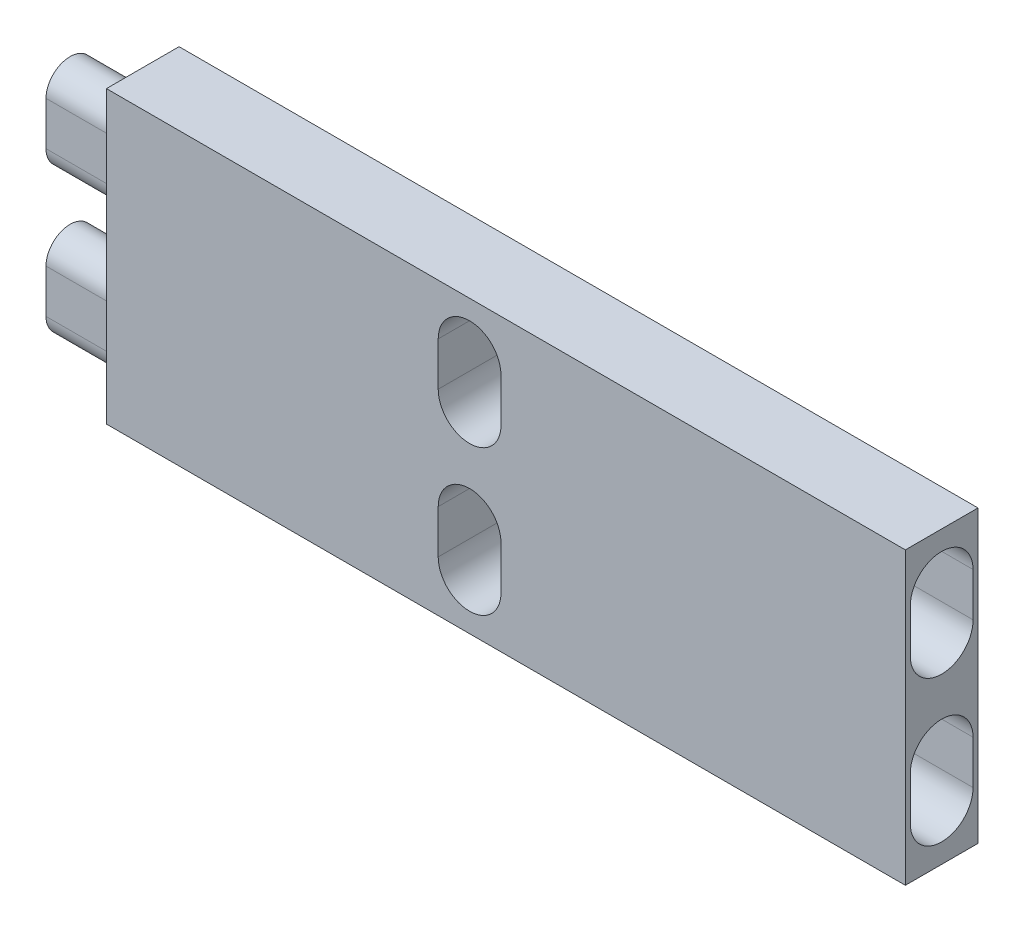
ISO-10303-21;
HEADER;
FILE_DESCRIPTION(('STEP AP214'),'2;1');
FILE_NAME('part.step','',(''),(''),'','','');
FILE_SCHEMA(('AUTOMOTIVE_DESIGN { 1 0 10303 214 1 1 1 1 }'));
ENDSEC;
DATA;
#1=APPLICATION_CONTEXT('core data for automotive mechanical design processes');
#2=APPLICATION_PROTOCOL_DEFINITION('international standard','automotive_design',2000,#1);
#3=PRODUCT_CONTEXT('',#1,'mechanical');
#4=PRODUCT('Part','Part','',(#3));
#5=PRODUCT_RELATED_PRODUCT_CATEGORY('part','',(#4));
#6=PRODUCT_DEFINITION_FORMATION('','',#4);
#7=PRODUCT_DEFINITION_CONTEXT('part definition',#1,'design');
#8=PRODUCT_DEFINITION('design','',#6,#7);
#9=PRODUCT_DEFINITION_SHAPE('','',#8);
#10=(LENGTH_UNIT() NAMED_UNIT(*) SI_UNIT(.MILLI.,.METRE.));
#11=(NAMED_UNIT(*) PLANE_ANGLE_UNIT() SI_UNIT($,.RADIAN.));
#12=(NAMED_UNIT(*) SI_UNIT($,.STERADIAN.) SOLID_ANGLE_UNIT());
#13=UNCERTAINTY_MEASURE_WITH_UNIT(LENGTH_MEASURE(1.E-05),#10,'distance_accuracy_value','');
#14=(GEOMETRIC_REPRESENTATION_CONTEXT(3) GLOBAL_UNCERTAINTY_ASSIGNED_CONTEXT((#13)) GLOBAL_UNIT_ASSIGNED_CONTEXT((#10,
#11,#12)) REPRESENTATION_CONTEXT('',''));
#15=CARTESIAN_POINT('',(0.,0.,0.));
#16=DIRECTION('',(0.,0.,1.));
#17=DIRECTION('',(1.,0.,0.));
#18=AXIS2_PLACEMENT_3D('',#15,#16,#17);
#19=CARTESIAN_POINT('',(30.,-10.,2.5));
#20=DIRECTION('',(0.,1.,0.));
#21=DIRECTION('',(-1.,0.,0.));
#22=AXIS2_PLACEMENT_3D('',#19,#20,#21);
#23=PLANE('',#22);
#24=DIRECTION('',(0.,0.,1.));
#25=VECTOR('',#24,1.);
#26=CARTESIAN_POINT('',(-25.,-10.,-2.5));
#27=LINE('',#26,#25);
#28=CARTESIAN_POINT('',(-25.,-10.,-2.5));
#29=VERTEX_POINT('',#28);
#30=CARTESIAN_POINT('',(-25.,-10.,2.5));
#31=VERTEX_POINT('',#30);
#32=EDGE_CURVE('E414',#29,#31,#27,.T.);
#33=ORIENTED_EDGE('',*,*,#32,.F.);
#34=DIRECTION('',(1.,0.,0.));
#35=VECTOR('',#34,1.);
#36=CARTESIAN_POINT('',(30.,-10.,-2.5));
#37=LINE('',#36,#35);
#38=CARTESIAN_POINT('',(30.,-10.,-2.5));
#39=VERTEX_POINT('',#38);
#40=EDGE_CURVE('E420',#29,#39,#37,.T.);
#41=ORIENTED_EDGE('',*,*,#40,.T.);
#42=DIRECTION('',(0.,0.,-1.));
#43=VECTOR('',#42,1.);
#44=CARTESIAN_POINT('',(30.,-10.,2.5));
#45=LINE('',#44,#43);
#46=CARTESIAN_POINT('',(30.,-10.,2.5));
#47=VERTEX_POINT('',#46);
#48=EDGE_CURVE('E11',#47,#39,#45,.T.);
#49=ORIENTED_EDGE('',*,*,#48,.F.);
#50=DIRECTION('',(1.,0.,0.));
#51=VECTOR('',#50,1.);
#52=CARTESIAN_POINT('',(30.,-10.,2.5));
#53=LINE('',#52,#51);
#54=EDGE_CURVE('E421',#31,#47,#53,.T.);
#55=ORIENTED_EDGE('',*,*,#54,.F.);
#56=EDGE_LOOP('',(#33,#41,#49,#55));
#57=FACE_BOUND('',#56,.T.);
#58=ADVANCED_FACE('F33',(#57),#23,.F.);
#59=CARTESIAN_POINT('',(30.,10.,2.5));
#60=DIRECTION('',(0.,-1.,0.));
#61=DIRECTION('',(1.,0.,0.));
#62=AXIS2_PLACEMENT_3D('',#59,#60,#61);
#63=PLANE('',#62);
#64=DIRECTION('',(0.,0.,-1.));
#65=VECTOR('',#64,1.);
#66=CARTESIAN_POINT('',(-25.,10.,-2.5));
#67=LINE('',#66,#65);
#68=CARTESIAN_POINT('',(-25.,10.,2.5));
#69=VERTEX_POINT('',#68);
#70=CARTESIAN_POINT('',(-25.,10.,-2.5));
#71=VERTEX_POINT('',#70);
#72=EDGE_CURVE('E418',#69,#71,#67,.T.);
#73=ORIENTED_EDGE('',*,*,#72,.F.);
#74=DIRECTION('',(-1.,0.,0.));
#75=VECTOR('',#74,1.);
#76=CARTESIAN_POINT('',(30.,10.,2.5));
#77=LINE('',#76,#75);
#78=CARTESIAN_POINT('',(30.,10.,2.5));
#79=VERTEX_POINT('',#78);
#80=EDGE_CURVE('E426',#79,#69,#77,.T.);
#81=ORIENTED_EDGE('',*,*,#80,.F.);
#82=DIRECTION('',(0.,0.,-1.));
#83=VECTOR('',#82,1.);
#84=CARTESIAN_POINT('',(30.,10.,2.5));
#85=LINE('',#84,#83);
#86=CARTESIAN_POINT('',(30.,10.,-2.5));
#87=VERTEX_POINT('',#86);
#88=EDGE_CURVE('E41',#79,#87,#85,.T.);
#89=ORIENTED_EDGE('',*,*,#88,.T.);
#90=DIRECTION('',(-1.,0.,0.));
#91=VECTOR('',#90,1.);
#92=CARTESIAN_POINT('',(30.,10.,-2.5));
#93=LINE('',#92,#91);
#94=EDGE_CURVE('E424',#87,#71,#93,.T.);
#95=ORIENTED_EDGE('',*,*,#94,.T.);
#96=EDGE_LOOP('',(#73,#81,#89,#95));
#97=FACE_BOUND('',#96,.T.);
#98=ADVANCED_FACE('F439',(#97),#63,.F.);
#99=CARTESIAN_POINT('',(0.,0.,2.5));
#100=DIRECTION('',(0.,0.,1.));
#101=DIRECTION('',(1.,0.,0.));
#102=AXIS2_PLACEMENT_3D('',#99,#100,#101);
#103=PLANE('',#102);
#104=CARTESIAN_POINT('',(0.,-6.5,2.5));
#105=DIRECTION('',(0.,0.,1.));
#106=DIRECTION('',(1.,0.,0.));
#107=AXIS2_PLACEMENT_3D('',#104,#105,#106);
#108=CIRCLE('',#107,2.16);
#109=CARTESIAN_POINT('',(-2.16,-6.5,2.5));
#110=VERTEX_POINT('',#109);
#111=CARTESIAN_POINT('',(2.16,-6.5,2.5));
#112=VERTEX_POINT('',#111);
#113=EDGE_CURVE('E251',#110,#112,#108,.T.);
#114=ORIENTED_EDGE('',*,*,#113,.F.);
#115=DIRECTION('',(0.,-1.,0.));
#116=VECTOR('',#115,1.);
#117=CARTESIAN_POINT('',(-2.16,0.,2.5));
#118=LINE('',#117,#116);
#119=CARTESIAN_POINT('',(-2.16,-3.5,2.5));
#120=VERTEX_POINT('',#119);
#121=EDGE_CURVE('E244',#120,#110,#118,.T.);
#122=ORIENTED_EDGE('',*,*,#121,.F.);
#123=CARTESIAN_POINT('',(0.,-3.5,2.5));
#124=DIRECTION('',(0.,0.,1.));
#125=DIRECTION('',(1.,0.,0.));
#126=AXIS2_PLACEMENT_3D('',#123,#124,#125);
#127=CIRCLE('',#126,2.16);
#128=CARTESIAN_POINT('',(2.16,-3.5,2.5));
#129=VERTEX_POINT('',#128);
#130=EDGE_CURVE('E224',#129,#120,#127,.T.);
#131=ORIENTED_EDGE('',*,*,#130,.F.);
#132=DIRECTION('',(0.,1.,0.));
#133=VECTOR('',#132,1.);
#134=CARTESIAN_POINT('',(2.16,0.,2.5));
#135=LINE('',#134,#133);
#136=EDGE_CURVE('E249',#112,#129,#135,.T.);
#137=ORIENTED_EDGE('',*,*,#136,.F.);
#138=EDGE_LOOP('',(#114,#122,#131,#137));
#139=FACE_BOUND('',#138,.T.);
#140=CARTESIAN_POINT('',(0.,6.5,2.5));
#141=DIRECTION('',(0.,0.,1.));
#142=DIRECTION('',(1.,0.,0.));
#143=AXIS2_PLACEMENT_3D('',#140,#141,#142);
#144=CIRCLE('',#143,2.16);
#145=CARTESIAN_POINT('',(2.16,6.5,2.5));
#146=VERTEX_POINT('',#145);
#147=CARTESIAN_POINT('',(-2.16,6.5,2.5));
#148=VERTEX_POINT('',#147);
#149=EDGE_CURVE('E280',#146,#148,#144,.T.);
#150=ORIENTED_EDGE('',*,*,#149,.F.);
#151=DIRECTION('',(0.,1.,0.));
#152=VECTOR('',#151,1.);
#153=CARTESIAN_POINT('',(2.16,0.,2.5));
#154=LINE('',#153,#152);
#155=CARTESIAN_POINT('',(2.16,3.5,2.5));
#156=VERTEX_POINT('',#155);
#157=EDGE_CURVE('E267',#156,#146,#154,.T.);
#158=ORIENTED_EDGE('',*,*,#157,.F.);
#159=CARTESIAN_POINT('',(0.,3.5,2.5));
#160=DIRECTION('',(0.,0.,1.));
#161=DIRECTION('',(1.,0.,0.));
#162=AXIS2_PLACEMENT_3D('',#159,#160,#161);
#163=CIRCLE('',#162,2.16);
#164=CARTESIAN_POINT('',(-2.16,3.5,2.5));
#165=VERTEX_POINT('',#164);
#166=EDGE_CURVE('E275',#165,#156,#163,.T.);
#167=ORIENTED_EDGE('',*,*,#166,.F.);
#168=DIRECTION('',(0.,-1.,0.));
#169=VECTOR('',#168,1.);
#170=CARTESIAN_POINT('',(-2.16,0.,2.5));
#171=LINE('',#170,#169);
#172=EDGE_CURVE('E278',#148,#165,#171,.T.);
#173=ORIENTED_EDGE('',*,*,#172,.F.);
#174=EDGE_LOOP('',(#150,#158,#167,#173));
#175=FACE_BOUND('',#174,.T.);
#176=ORIENTED_EDGE('',*,*,#80,.T.);
#177=DIRECTION('',(0.,1.,0.));
#178=VECTOR('',#177,1.);
#179=CARTESIAN_POINT('',(-25.,10.,2.5));
#180=LINE('',#179,#178);
#181=EDGE_CURVE('E416',#31,#69,#180,.T.);
#182=ORIENTED_EDGE('',*,*,#181,.F.);
#183=ORIENTED_EDGE('',*,*,#54,.T.);
#184=DIRECTION('',(0.,1.,0.));
#185=VECTOR('',#184,1.);
#186=CARTESIAN_POINT('',(30.,-10.,2.5));
#187=LINE('',#186,#185);
#188=EDGE_CURVE('E423',#47,#79,#187,.T.);
#189=ORIENTED_EDGE('',*,*,#188,.T.);
#190=EDGE_LOOP('',(#176,#182,#183,#189));
#191=FACE_BOUND('',#190,.T.);
#192=ADVANCED_FACE('F454',(#139,#175,#191),#103,.T.);
#193=CARTESIAN_POINT('',(0.,0.,-2.5));
#194=DIRECTION('',(0.,0.,1.));
#195=DIRECTION('',(1.,0.,0.));
#196=AXIS2_PLACEMENT_3D('',#193,#194,#195);
#197=PLANE('',#196);
#198=DIRECTION('',(0.,1.,0.));
#199=VECTOR('',#198,1.);
#200=CARTESIAN_POINT('',(-2.16,-6.5,-2.5));
#201=LINE('',#200,#199);
#202=CARTESIAN_POINT('',(-2.16,-6.5,-2.5));
#203=VERTEX_POINT('',#202);
#204=CARTESIAN_POINT('',(-2.16,-3.5,-2.5));
#205=VERTEX_POINT('',#204);
#206=EDGE_CURVE('E230',#203,#205,#201,.T.);
#207=ORIENTED_EDGE('',*,*,#206,.F.);
#208=CARTESIAN_POINT('',(0.,-6.5,-2.5));
#209=DIRECTION('',(0.,0.,-1.));
#210=DIRECTION('',(-1.,0.,0.));
#211=AXIS2_PLACEMENT_3D('',#208,#209,#210);
#212=CIRCLE('',#211,2.16);
#213=CARTESIAN_POINT('',(2.16,-6.5,-2.5));
#214=VERTEX_POINT('',#213);
#215=EDGE_CURVE('E56',#214,#203,#212,.T.);
#216=ORIENTED_EDGE('',*,*,#215,.F.);
#217=DIRECTION('',(0.,-1.,0.));
#218=VECTOR('',#217,1.);
#219=CARTESIAN_POINT('',(2.16,-6.5,-2.5));
#220=LINE('',#219,#218);
#221=CARTESIAN_POINT('',(2.16,-3.5,-2.5));
#222=VERTEX_POINT('',#221);
#223=EDGE_CURVE('E237',#222,#214,#220,.T.);
#224=ORIENTED_EDGE('',*,*,#223,.F.);
#225=CARTESIAN_POINT('',(0.,-3.5,-2.5));
#226=DIRECTION('',(0.,0.,-1.));
#227=DIRECTION('',(-1.,0.,0.));
#228=AXIS2_PLACEMENT_3D('',#225,#226,#227);
#229=CIRCLE('',#228,2.16);
#230=EDGE_CURVE('E221',#205,#222,#229,.T.);
#231=ORIENTED_EDGE('',*,*,#230,.F.);
#232=EDGE_LOOP('',(#207,#216,#224,#231));
#233=FACE_BOUND('',#232,.T.);
#234=DIRECTION('',(0.,-1.,0.));
#235=VECTOR('',#234,1.);
#236=CARTESIAN_POINT('',(2.16,6.5,-2.5));
#237=LINE('',#236,#235);
#238=CARTESIAN_POINT('',(2.16,6.5,-2.5));
#239=VERTEX_POINT('',#238);
#240=CARTESIAN_POINT('',(2.16,3.5,-2.5));
#241=VERTEX_POINT('',#240);
#242=EDGE_CURVE('E255',#239,#241,#237,.T.);
#243=ORIENTED_EDGE('',*,*,#242,.F.);
#244=CARTESIAN_POINT('',(0.,6.5,-2.5));
#245=DIRECTION('',(0.,0.,-1.));
#246=DIRECTION('',(-1.,0.,0.));
#247=AXIS2_PLACEMENT_3D('',#244,#245,#246);
#248=CIRCLE('',#247,2.16);
#249=CARTESIAN_POINT('',(-2.16,6.5,-2.5));
#250=VERTEX_POINT('',#249);
#251=EDGE_CURVE('E253',#250,#239,#248,.T.);
#252=ORIENTED_EDGE('',*,*,#251,.F.);
#253=DIRECTION('',(0.,1.,0.));
#254=VECTOR('',#253,1.);
#255=CARTESIAN_POINT('',(-2.16,6.5,-2.5));
#256=LINE('',#255,#254);
#257=CARTESIAN_POINT('',(-2.16,3.5,-2.5));
#258=VERTEX_POINT('',#257);
#259=EDGE_CURVE('E261',#258,#250,#256,.T.);
#260=ORIENTED_EDGE('',*,*,#259,.F.);
#261=CARTESIAN_POINT('',(0.,3.5,-2.5));
#262=DIRECTION('',(0.,0.,-1.));
#263=DIRECTION('',(-1.,0.,0.));
#264=AXIS2_PLACEMENT_3D('',#261,#262,#263);
#265=CIRCLE('',#264,2.16);
#266=EDGE_CURVE('E258',#241,#258,#265,.T.);
#267=ORIENTED_EDGE('',*,*,#266,.F.);
#268=EDGE_LOOP('',(#243,#252,#260,#267));
#269=FACE_BOUND('',#268,.T.);
#270=DIRECTION('',(0.,-1.,0.));
#271=VECTOR('',#270,1.);
#272=CARTESIAN_POINT('',(-25.,10.,-2.5));
#273=LINE('',#272,#271);
#274=EDGE_CURVE('E406',#71,#29,#273,.T.);
#275=ORIENTED_EDGE('',*,*,#274,.F.);
#276=ORIENTED_EDGE('',*,*,#94,.F.);
#277=DIRECTION('',(0.,1.,0.));
#278=VECTOR('',#277,1.);
#279=CARTESIAN_POINT('',(30.,-10.,-2.5));
#280=LINE('',#279,#278);
#281=EDGE_CURVE('E430',#39,#87,#280,.T.);
#282=ORIENTED_EDGE('',*,*,#281,.F.);
#283=ORIENTED_EDGE('',*,*,#40,.F.);
#284=EDGE_LOOP('',(#275,#276,#282,#283));
#285=FACE_BOUND('',#284,.T.);
#286=ADVANCED_FACE('F234',(#233,#269,#285),#197,.F.);
#287=CARTESIAN_POINT('',(30.,-10.,2.5));
#288=DIRECTION('',(-1.,0.,0.));
#289=DIRECTION('',(0.,0.,1.));
#290=AXIS2_PLACEMENT_3D('',#287,#288,#289);
#291=PLANE('',#290);
#292=DIRECTION('',(0.,1.,0.));
#293=VECTOR('',#292,1.);
#294=CARTESIAN_POINT('',(30.,3.5,-2.16));
#295=LINE('',#294,#293);
#296=CARTESIAN_POINT('',(30.,3.5,-2.16));
#297=VERTEX_POINT('',#296);
#298=CARTESIAN_POINT('',(30.,6.5,-2.16));
#299=VERTEX_POINT('',#298);
#300=EDGE_CURVE('E298',#297,#299,#295,.T.);
#301=ORIENTED_EDGE('',*,*,#300,.F.);
#302=CARTESIAN_POINT('',(30.,3.5,0.));
#303=DIRECTION('',(1.,0.,0.));
#304=DIRECTION('',(0.,0.,-1.));
#305=AXIS2_PLACEMENT_3D('',#302,#303,#304);
#306=CIRCLE('',#305,2.16);
#307=CARTESIAN_POINT('',(30.,3.5,2.16));
#308=VERTEX_POINT('',#307);
#309=EDGE_CURVE('E282',#308,#297,#306,.T.);
#310=ORIENTED_EDGE('',*,*,#309,.F.);
#311=DIRECTION('',(0.,-1.,0.));
#312=VECTOR('',#311,1.);
#313=CARTESIAN_POINT('',(30.,6.5,2.16));
#314=LINE('',#313,#312);
#315=CARTESIAN_POINT('',(30.,6.5,2.16));
#316=VERTEX_POINT('',#315);
#317=EDGE_CURVE('E287',#316,#308,#314,.T.);
#318=ORIENTED_EDGE('',*,*,#317,.F.);
#319=CARTESIAN_POINT('',(30.,6.5,0.));
#320=DIRECTION('',(1.,0.,0.));
#321=DIRECTION('',(0.,0.,-1.));
#322=AXIS2_PLACEMENT_3D('',#319,#320,#321);
#323=CIRCLE('',#322,2.16);
#324=EDGE_CURVE('E301',#299,#316,#323,.T.);
#325=ORIENTED_EDGE('',*,*,#324,.F.);
#326=EDGE_LOOP('',(#301,#310,#318,#325));
#327=FACE_BOUND('',#326,.T.);
#328=DIRECTION('',(0.,1.,0.));
#329=VECTOR('',#328,1.);
#330=CARTESIAN_POINT('',(30.,-6.5,-2.16));
#331=LINE('',#330,#329);
#332=CARTESIAN_POINT('',(30.,-6.5,-2.16));
#333=VERTEX_POINT('',#332);
#334=CARTESIAN_POINT('',(30.,-3.5,-2.16));
#335=VERTEX_POINT('',#334);
#336=EDGE_CURVE('E330',#333,#335,#331,.T.);
#337=ORIENTED_EDGE('',*,*,#336,.F.);
#338=CARTESIAN_POINT('',(30.,-6.5,0.));
#339=DIRECTION('',(1.,0.,0.));
#340=DIRECTION('',(0.,0.,-1.));
#341=AXIS2_PLACEMENT_3D('',#338,#339,#340);
#342=CIRCLE('',#341,2.16);
#343=CARTESIAN_POINT('',(30.,-6.5,2.16));
#344=VERTEX_POINT('',#343);
#345=EDGE_CURVE('E308',#344,#333,#342,.T.);
#346=ORIENTED_EDGE('',*,*,#345,.F.);
#347=DIRECTION('',(0.,-1.,0.));
#348=VECTOR('',#347,1.);
#349=CARTESIAN_POINT('',(30.,-3.5,2.16));
#350=LINE('',#349,#348);
#351=CARTESIAN_POINT('',(30.,-3.5,2.16));
#352=VERTEX_POINT('',#351);
#353=EDGE_CURVE('E319',#352,#344,#350,.T.);
#354=ORIENTED_EDGE('',*,*,#353,.F.);
#355=CARTESIAN_POINT('',(30.,-3.5,0.));
#356=DIRECTION('',(1.,0.,0.));
#357=DIRECTION('',(0.,0.,-1.));
#358=AXIS2_PLACEMENT_3D('',#355,#356,#357);
#359=CIRCLE('',#358,2.16);
#360=EDGE_CURVE('E333',#335,#352,#359,.T.);
#361=ORIENTED_EDGE('',*,*,#360,.F.);
#362=EDGE_LOOP('',(#337,#346,#354,#361));
#363=FACE_BOUND('',#362,.T.);
#364=ORIENTED_EDGE('',*,*,#281,.T.);
#365=ORIENTED_EDGE('',*,*,#88,.F.);
#366=ORIENTED_EDGE('',*,*,#188,.F.);
#367=ORIENTED_EDGE('',*,*,#48,.T.);
#368=EDGE_LOOP('',(#364,#365,#366,#367));
#369=FACE_BOUND('',#368,.T.);
#370=ADVANCED_FACE('F455',(#327,#363,#369),#291,.F.);
#371=CARTESIAN_POINT('',(-25.,0.,0.));
#372=DIRECTION('',(-1.,0.,0.));
#373=DIRECTION('',(0.,0.,1.));
#374=AXIS2_PLACEMENT_3D('',#371,#372,#373);
#375=PLANE('',#374);
#376=DIRECTION('',(0.,1.,0.));
#377=VECTOR('',#376,1.);
#378=CARTESIAN_POINT('',(-25.,-3.5,1.66));
#379=LINE('',#378,#377);
#380=CARTESIAN_POINT('',(-25.,-6.5,1.66));
#381=VERTEX_POINT('',#380);
#382=CARTESIAN_POINT('',(-25.,-3.5,1.66));
#383=VERTEX_POINT('',#382);
#384=EDGE_CURVE('E357',#381,#383,#379,.T.);
#385=ORIENTED_EDGE('',*,*,#384,.F.);
#386=CARTESIAN_POINT('',(-25.,-6.5,0.));
#387=DIRECTION('',(-1.,0.,0.));
#388=DIRECTION('',(0.,0.,1.));
#389=AXIS2_PLACEMENT_3D('',#386,#387,#388);
#390=CIRCLE('',#389,1.66);
#391=CARTESIAN_POINT('',(-25.,-6.5,-1.66));
#392=VERTEX_POINT('',#391);
#393=EDGE_CURVE('E354',#392,#381,#390,.T.);
#394=ORIENTED_EDGE('',*,*,#393,.F.);
#395=DIRECTION('',(0.,-1.,0.));
#396=VECTOR('',#395,1.);
#397=CARTESIAN_POINT('',(-25.,-3.5,-1.66));
#398=LINE('',#397,#396);
#399=CARTESIAN_POINT('',(-25.,-3.5,-1.66));
#400=VERTEX_POINT('',#399);
#401=EDGE_CURVE('E350',#400,#392,#398,.T.);
#402=ORIENTED_EDGE('',*,*,#401,.F.);
#403=CARTESIAN_POINT('',(-25.,-3.5,0.));
#404=DIRECTION('',(-1.,0.,0.));
#405=DIRECTION('',(0.,0.,1.));
#406=AXIS2_PLACEMENT_3D('',#403,#404,#405);
#407=CIRCLE('',#406,1.66);
#408=EDGE_CURVE('E347',#383,#400,#407,.T.);
#409=ORIENTED_EDGE('',*,*,#408,.F.);
#410=EDGE_LOOP('',(#385,#394,#402,#409));
#411=FACE_BOUND('',#410,.T.);
#412=DIRECTION('',(0.,1.,0.));
#413=VECTOR('',#412,1.);
#414=CARTESIAN_POINT('',(-25.,6.5,1.66));
#415=LINE('',#414,#413);
#416=CARTESIAN_POINT('',(-25.,3.5,1.66));
#417=VERTEX_POINT('',#416);
#418=CARTESIAN_POINT('',(-25.,6.5,1.66));
#419=VERTEX_POINT('',#418);
#420=EDGE_CURVE('E390',#417,#419,#415,.T.);
#421=ORIENTED_EDGE('',*,*,#420,.F.);
#422=CARTESIAN_POINT('',(-25.,3.5,0.));
#423=DIRECTION('',(-1.,0.,0.));
#424=DIRECTION('',(0.,0.,1.));
#425=AXIS2_PLACEMENT_3D('',#422,#423,#424);
#426=CIRCLE('',#425,1.66);
#427=CARTESIAN_POINT('',(-25.,3.5,-1.66));
#428=VERTEX_POINT('',#427);
#429=EDGE_CURVE('E387',#428,#417,#426,.T.);
#430=ORIENTED_EDGE('',*,*,#429,.F.);
#431=DIRECTION('',(0.,-1.,0.));
#432=VECTOR('',#431,1.);
#433=CARTESIAN_POINT('',(-25.,6.5,-1.66));
#434=LINE('',#433,#432);
#435=CARTESIAN_POINT('',(-25.,6.5,-1.66));
#436=VERTEX_POINT('',#435);
#437=EDGE_CURVE('E383',#436,#428,#434,.T.);
#438=ORIENTED_EDGE('',*,*,#437,.F.);
#439=CARTESIAN_POINT('',(-25.,6.5,0.));
#440=DIRECTION('',(-1.,0.,0.));
#441=DIRECTION('',(0.,0.,1.));
#442=AXIS2_PLACEMENT_3D('',#439,#440,#441);
#443=CIRCLE('',#442,1.66);
#444=EDGE_CURVE('E380',#419,#436,#443,.T.);
#445=ORIENTED_EDGE('',*,*,#444,.F.);
#446=EDGE_LOOP('',(#421,#430,#438,#445));
#447=FACE_BOUND('',#446,.T.);
#448=ORIENTED_EDGE('',*,*,#274,.T.);
#449=ORIENTED_EDGE('',*,*,#32,.T.);
#450=ORIENTED_EDGE('',*,*,#181,.T.);
#451=ORIENTED_EDGE('',*,*,#72,.T.);
#452=EDGE_LOOP('',(#448,#449,#450,#451));
#453=FACE_BOUND('',#452,.T.);
#454=ADVANCED_FACE('F448',(#411,#447,#453),#375,.T.);
#455=CARTESIAN_POINT('',(-25.,6.5,0.));
#456=DIRECTION('',(-1.,0.,0.));
#457=DIRECTION('',(0.,0.,1.));
#458=AXIS2_PLACEMENT_3D('',#455,#456,#457);
#459=CYLINDRICAL_SURFACE('',#458,1.66);
#460=CARTESIAN_POINT('',(-30.,6.5,0.));
#461=DIRECTION('',(-1.,0.,0.));
#462=DIRECTION('',(0.,0.,1.));
#463=AXIS2_PLACEMENT_3D('',#460,#461,#462);
#464=CIRCLE('',#463,1.66);
#465=CARTESIAN_POINT('',(-30.,6.5,1.66));
#466=VERTEX_POINT('',#465);
#467=CARTESIAN_POINT('',(-30.,6.5,-1.66));
#468=VERTEX_POINT('',#467);
#469=EDGE_CURVE('E373',#466,#468,#464,.T.);
#470=ORIENTED_EDGE('',*,*,#469,.F.);
#471=DIRECTION('',(-1.,0.,0.));
#472=VECTOR('',#471,1.);
#473=CARTESIAN_POINT('',(-25.,6.5,1.66));
#474=LINE('',#473,#472);
#475=EDGE_CURVE('E404',#419,#466,#474,.T.);
#476=ORIENTED_EDGE('',*,*,#475,.F.);
#477=ORIENTED_EDGE('',*,*,#444,.T.);
#478=DIRECTION('',(-1.,0.,0.));
#479=VECTOR('',#478,1.);
#480=CARTESIAN_POINT('',(-25.,6.5,-1.66));
#481=LINE('',#480,#479);
#482=EDGE_CURVE('E393',#436,#468,#481,.T.);
#483=ORIENTED_EDGE('',*,*,#482,.T.);
#484=EDGE_LOOP('',(#470,#476,#477,#483));
#485=FACE_BOUND('',#484,.T.);
#486=ADVANCED_FACE('F463',(#485),#459,.T.);
#487=CARTESIAN_POINT('',(-25.,6.5,1.66));
#488=DIRECTION('',(0.,0.,1.));
#489=DIRECTION('',(0.,-1.,0.));
#490=AXIS2_PLACEMENT_3D('',#487,#488,#489);
#491=PLANE('',#490);
#492=DIRECTION('',(0.,1.,0.));
#493=VECTOR('',#492,1.);
#494=CARTESIAN_POINT('',(-30.,6.5,1.66));
#495=LINE('',#494,#493);
#496=CARTESIAN_POINT('',(-30.,3.5,1.66));
#497=VERTEX_POINT('',#496);
#498=EDGE_CURVE('E384',#497,#466,#495,.T.);
#499=ORIENTED_EDGE('',*,*,#498,.F.);
#500=DIRECTION('',(-1.,0.,0.));
#501=VECTOR('',#500,1.);
#502=CARTESIAN_POINT('',(-25.,3.5,1.66));
#503=LINE('',#502,#501);
#504=EDGE_CURVE('E407',#417,#497,#503,.T.);
#505=ORIENTED_EDGE('',*,*,#504,.F.);
#506=ORIENTED_EDGE('',*,*,#420,.T.);
#507=ORIENTED_EDGE('',*,*,#475,.T.);
#508=EDGE_LOOP('',(#499,#505,#506,#507));
#509=FACE_BOUND('',#508,.T.);
#510=ADVANCED_FACE('F482',(#509),#491,.T.);
#511=CARTESIAN_POINT('',(-25.,3.5,0.));
#512=DIRECTION('',(-1.,0.,0.));
#513=DIRECTION('',(0.,0.,1.));
#514=AXIS2_PLACEMENT_3D('',#511,#512,#513);
#515=CYLINDRICAL_SURFACE('',#514,1.66);
#516=CARTESIAN_POINT('',(-30.,3.5,0.));
#517=DIRECTION('',(-1.,0.,0.));
#518=DIRECTION('',(0.,0.,1.));
#519=AXIS2_PLACEMENT_3D('',#516,#517,#518);
#520=CIRCLE('',#519,1.66);
#521=CARTESIAN_POINT('',(-30.,3.5,-1.66));
#522=VERTEX_POINT('',#521);
#523=EDGE_CURVE('E399',#522,#497,#520,.T.);
#524=ORIENTED_EDGE('',*,*,#523,.F.);
#525=DIRECTION('',(-1.,0.,0.));
#526=VECTOR('',#525,1.);
#527=CARTESIAN_POINT('',(-25.,3.5,-1.66));
#528=LINE('',#527,#526);
#529=EDGE_CURVE('E409',#428,#522,#528,.T.);
#530=ORIENTED_EDGE('',*,*,#529,.F.);
#531=ORIENTED_EDGE('',*,*,#429,.T.);
#532=ORIENTED_EDGE('',*,*,#504,.T.);
#533=EDGE_LOOP('',(#524,#530,#531,#532));
#534=FACE_BOUND('',#533,.T.);
#535=ADVANCED_FACE('F488',(#534),#515,.T.);
#536=CARTESIAN_POINT('',(-25.,6.5,-1.66));
#537=DIRECTION('',(0.,0.,-1.));
#538=DIRECTION('',(0.,1.,0.));
#539=AXIS2_PLACEMENT_3D('',#536,#537,#538);
#540=PLANE('',#539);
#541=DIRECTION('',(0.,-1.,0.));
#542=VECTOR('',#541,1.);
#543=CARTESIAN_POINT('',(-30.,6.5,-1.66));
#544=LINE('',#543,#542);
#545=EDGE_CURVE('E396',#468,#522,#544,.T.);
#546=ORIENTED_EDGE('',*,*,#545,.F.);
#547=ORIENTED_EDGE('',*,*,#482,.F.);
#548=ORIENTED_EDGE('',*,*,#437,.T.);
#549=ORIENTED_EDGE('',*,*,#529,.T.);
#550=EDGE_LOOP('',(#546,#547,#548,#549));
#551=FACE_BOUND('',#550,.T.);
#552=ADVANCED_FACE('F484',(#551),#540,.T.);
#553=CARTESIAN_POINT('',(-25.,-3.5,0.));
#554=DIRECTION('',(-1.,0.,0.));
#555=DIRECTION('',(0.,0.,1.));
#556=AXIS2_PLACEMENT_3D('',#553,#554,#555);
#557=CYLINDRICAL_SURFACE('',#556,1.66);
#558=CARTESIAN_POINT('',(-30.,-3.5,0.));
#559=DIRECTION('',(-1.,0.,0.));
#560=DIRECTION('',(0.,0.,1.));
#561=AXIS2_PLACEMENT_3D('',#558,#559,#560);
#562=CIRCLE('',#561,1.66);
#563=CARTESIAN_POINT('',(-30.,-3.5,1.66));
#564=VERTEX_POINT('',#563);
#565=CARTESIAN_POINT('',(-30.,-3.5,-1.66));
#566=VERTEX_POINT('',#565);
#567=EDGE_CURVE('E340',#564,#566,#562,.T.);
#568=ORIENTED_EDGE('',*,*,#567,.F.);
#569=DIRECTION('',(-1.,0.,0.));
#570=VECTOR('',#569,1.);
#571=CARTESIAN_POINT('',(-25.,-3.5,1.66));
#572=LINE('',#571,#570);
#573=EDGE_CURVE('E371',#383,#564,#572,.T.);
#574=ORIENTED_EDGE('',*,*,#573,.F.);
#575=ORIENTED_EDGE('',*,*,#408,.T.);
#576=DIRECTION('',(-1.,0.,0.));
#577=VECTOR('',#576,1.);
#578=CARTESIAN_POINT('',(-25.,-3.5,-1.66));
#579=LINE('',#578,#577);
#580=EDGE_CURVE('E360',#400,#566,#579,.T.);
#581=ORIENTED_EDGE('',*,*,#580,.T.);
#582=EDGE_LOOP('',(#568,#574,#575,#581));
#583=FACE_BOUND('',#582,.T.);
#584=ADVANCED_FACE('F487',(#583),#557,.T.);
#585=CARTESIAN_POINT('',(-25.,-3.5,1.66));
#586=DIRECTION('',(0.,0.,1.));
#587=DIRECTION('',(0.,-1.,0.));
#588=AXIS2_PLACEMENT_3D('',#585,#586,#587);
#589=PLANE('',#588);
#590=DIRECTION('',(0.,1.,0.));
#591=VECTOR('',#590,1.);
#592=CARTESIAN_POINT('',(-30.,-3.5,1.66));
#593=LINE('',#592,#591);
#594=CARTESIAN_POINT('',(-30.,-6.5,1.66));
#595=VERTEX_POINT('',#594);
#596=EDGE_CURVE('E351',#595,#564,#593,.T.);
#597=ORIENTED_EDGE('',*,*,#596,.F.);
#598=DIRECTION('',(-1.,0.,0.));
#599=VECTOR('',#598,1.);
#600=CARTESIAN_POINT('',(-25.,-6.5,1.66));
#601=LINE('',#600,#599);
#602=EDGE_CURVE('E374',#381,#595,#601,.T.);
#603=ORIENTED_EDGE('',*,*,#602,.F.);
#604=ORIENTED_EDGE('',*,*,#384,.T.);
#605=ORIENTED_EDGE('',*,*,#573,.T.);
#606=EDGE_LOOP('',(#597,#603,#604,#605));
#607=FACE_BOUND('',#606,.T.);
#608=ADVANCED_FACE('F498',(#607),#589,.T.);
#609=CARTESIAN_POINT('',(-25.,-6.5,0.));
#610=DIRECTION('',(-1.,0.,0.));
#611=DIRECTION('',(0.,0.,1.));
#612=AXIS2_PLACEMENT_3D('',#609,#610,#611);
#613=CYLINDRICAL_SURFACE('',#612,1.66);
#614=CARTESIAN_POINT('',(-30.,-6.5,0.));
#615=DIRECTION('',(-1.,0.,0.));
#616=DIRECTION('',(0.,0.,1.));
#617=AXIS2_PLACEMENT_3D('',#614,#615,#616);
#618=CIRCLE('',#617,1.66);
#619=CARTESIAN_POINT('',(-30.,-6.5,-1.66));
#620=VERTEX_POINT('',#619);
#621=EDGE_CURVE('E366',#620,#595,#618,.T.);
#622=ORIENTED_EDGE('',*,*,#621,.F.);
#623=DIRECTION('',(-1.,0.,0.));
#624=VECTOR('',#623,1.);
#625=CARTESIAN_POINT('',(-25.,-6.5,-1.66));
#626=LINE('',#625,#624);
#627=EDGE_CURVE('E376',#392,#620,#626,.T.);
#628=ORIENTED_EDGE('',*,*,#627,.F.);
#629=ORIENTED_EDGE('',*,*,#393,.T.);
#630=ORIENTED_EDGE('',*,*,#602,.T.);
#631=EDGE_LOOP('',(#622,#628,#629,#630));
#632=FACE_BOUND('',#631,.T.);
#633=ADVANCED_FACE('F504',(#632),#613,.T.);
#634=CARTESIAN_POINT('',(-25.,-3.5,-1.66));
#635=DIRECTION('',(0.,0.,-1.));
#636=DIRECTION('',(0.,1.,0.));
#637=AXIS2_PLACEMENT_3D('',#634,#635,#636);
#638=PLANE('',#637);
#639=DIRECTION('',(0.,-1.,0.));
#640=VECTOR('',#639,1.);
#641=CARTESIAN_POINT('',(-30.,-3.5,-1.66));
#642=LINE('',#641,#640);
#643=EDGE_CURVE('E363',#566,#620,#642,.T.);
#644=ORIENTED_EDGE('',*,*,#643,.F.);
#645=ORIENTED_EDGE('',*,*,#580,.F.);
#646=ORIENTED_EDGE('',*,*,#401,.T.);
#647=ORIENTED_EDGE('',*,*,#627,.T.);
#648=EDGE_LOOP('',(#644,#645,#646,#647));
#649=FACE_BOUND('',#648,.T.);
#650=ADVANCED_FACE('F500',(#649),#638,.T.);
#651=CARTESIAN_POINT('',(-30.,-10.,2.5));
#652=DIRECTION('',(1.,0.,0.));
#653=DIRECTION('',(0.,0.,-1.));
#654=AXIS2_PLACEMENT_3D('',#651,#652,#653);
#655=PLANE('',#654);
#656=ORIENTED_EDGE('',*,*,#567,.T.);
#657=ORIENTED_EDGE('',*,*,#643,.T.);
#658=ORIENTED_EDGE('',*,*,#621,.T.);
#659=ORIENTED_EDGE('',*,*,#596,.T.);
#660=EDGE_LOOP('',(#656,#657,#658,#659));
#661=FACE_BOUND('',#660,.T.);
#662=ADVANCED_FACE('F503',(#661),#655,.F.);
#663=ORIENTED_EDGE('',*,*,#469,.T.);
#664=ORIENTED_EDGE('',*,*,#545,.T.);
#665=ORIENTED_EDGE('',*,*,#523,.T.);
#666=ORIENTED_EDGE('',*,*,#498,.T.);
#667=EDGE_LOOP('',(#663,#664,#665,#666));
#668=FACE_BOUND('',#667,.T.);
#669=ADVANCED_FACE('F35',(#668),#655,.F.);
#670=CARTESIAN_POINT('',(24.,-6.5,0.));
#671=DIRECTION('',(1.,0.,0.));
#672=DIRECTION('',(0.,0.,-1.));
#673=AXIS2_PLACEMENT_3D('',#670,#671,#672);
#674=CYLINDRICAL_SURFACE('',#673,2.16);
#675=ORIENTED_EDGE('',*,*,#345,.T.);
#676=DIRECTION('',(1.,0.,0.));
#677=VECTOR('',#676,1.);
#678=CARTESIAN_POINT('',(24.,-6.5,-2.16));
#679=LINE('',#678,#677);
#680=CARTESIAN_POINT('',(24.,-6.5,-2.16));
#681=VERTEX_POINT('',#680);
#682=EDGE_CURVE('E328',#681,#333,#679,.T.);
#683=ORIENTED_EDGE('',*,*,#682,.F.);
#684=CARTESIAN_POINT('',(24.,-6.5,0.));
#685=DIRECTION('',(1.,0.,0.));
#686=DIRECTION('',(0.,0.,-1.));
#687=AXIS2_PLACEMENT_3D('',#684,#685,#686);
#688=CIRCLE('',#687,2.16);
#689=CARTESIAN_POINT('',(24.,-6.5,2.16));
#690=VERTEX_POINT('',#689);
#691=EDGE_CURVE('E315',#690,#681,#688,.T.);
#692=ORIENTED_EDGE('',*,*,#691,.F.);
#693=DIRECTION('',(1.,0.,0.));
#694=VECTOR('',#693,1.);
#695=CARTESIAN_POINT('',(24.,-6.5,2.16));
#696=LINE('',#695,#694);
#697=EDGE_CURVE('E338',#690,#344,#696,.T.);
#698=ORIENTED_EDGE('',*,*,#697,.T.);
#699=EDGE_LOOP('',(#675,#683,#692,#698));
#700=FACE_BOUND('',#699,.T.);
#701=ADVANCED_FACE('F512',(#700),#674,.F.);
#702=CARTESIAN_POINT('',(24.,-3.5,2.16));
#703=DIRECTION('',(0.,0.,1.));
#704=DIRECTION('',(0.,-1.,0.));
#705=AXIS2_PLACEMENT_3D('',#702,#703,#704);
#706=PLANE('',#705);
#707=ORIENTED_EDGE('',*,*,#353,.T.);
#708=ORIENTED_EDGE('',*,*,#697,.F.);
#709=DIRECTION('',(0.,-1.,0.));
#710=VECTOR('',#709,1.);
#711=CARTESIAN_POINT('',(24.,-3.5,2.16));
#712=LINE('',#711,#710);
#713=CARTESIAN_POINT('',(24.,-3.5,2.16));
#714=VERTEX_POINT('',#713);
#715=EDGE_CURVE('E325',#714,#690,#712,.T.);
#716=ORIENTED_EDGE('',*,*,#715,.F.);
#717=DIRECTION('',(1.,0.,0.));
#718=VECTOR('',#717,1.);
#719=CARTESIAN_POINT('',(24.,-3.5,2.16));
#720=LINE('',#719,#718);
#721=EDGE_CURVE('E341',#714,#352,#720,.T.);
#722=ORIENTED_EDGE('',*,*,#721,.T.);
#723=EDGE_LOOP('',(#707,#708,#716,#722));
#724=FACE_BOUND('',#723,.T.);
#725=ADVANCED_FACE('F515',(#724),#706,.F.);
#726=CARTESIAN_POINT('',(24.,-3.5,0.));
#727=DIRECTION('',(1.,0.,0.));
#728=DIRECTION('',(0.,0.,-1.));
#729=AXIS2_PLACEMENT_3D('',#726,#727,#728);
#730=CYLINDRICAL_SURFACE('',#729,2.16);
#731=ORIENTED_EDGE('',*,*,#360,.T.);
#732=ORIENTED_EDGE('',*,*,#721,.F.);
#733=CARTESIAN_POINT('',(24.,-3.5,0.));
#734=DIRECTION('',(1.,0.,0.));
#735=DIRECTION('',(0.,0.,-1.));
#736=AXIS2_PLACEMENT_3D('',#733,#734,#735);
#737=CIRCLE('',#736,2.16);
#738=CARTESIAN_POINT('',(24.,-3.5,-2.16));
#739=VERTEX_POINT('',#738);
#740=EDGE_CURVE('E322',#739,#714,#737,.T.);
#741=ORIENTED_EDGE('',*,*,#740,.F.);
#742=DIRECTION('',(1.,0.,0.));
#743=VECTOR('',#742,1.);
#744=CARTESIAN_POINT('',(24.,-3.5,-2.16));
#745=LINE('',#744,#743);
#746=EDGE_CURVE('E343',#739,#335,#745,.T.);
#747=ORIENTED_EDGE('',*,*,#746,.T.);
#748=EDGE_LOOP('',(#731,#732,#741,#747));
#749=FACE_BOUND('',#748,.T.);
#750=ADVANCED_FACE('F521',(#749),#730,.F.);
#751=CARTESIAN_POINT('',(24.,-6.5,-2.16));
#752=DIRECTION('',(0.,0.,-1.));
#753=DIRECTION('',(0.,1.,0.));
#754=AXIS2_PLACEMENT_3D('',#751,#752,#753);
#755=PLANE('',#754);
#756=ORIENTED_EDGE('',*,*,#336,.T.);
#757=ORIENTED_EDGE('',*,*,#746,.F.);
#758=DIRECTION('',(0.,1.,0.));
#759=VECTOR('',#758,1.);
#760=CARTESIAN_POINT('',(24.,-6.5,-2.16));
#761=LINE('',#760,#759);
#762=EDGE_CURVE('E318',#681,#739,#761,.T.);
#763=ORIENTED_EDGE('',*,*,#762,.F.);
#764=ORIENTED_EDGE('',*,*,#682,.T.);
#765=EDGE_LOOP('',(#756,#757,#763,#764));
#766=FACE_BOUND('',#765,.T.);
#767=ADVANCED_FACE('F517',(#766),#755,.F.);
#768=CARTESIAN_POINT('',(24.,-6.5,0.));
#769=DIRECTION('',(1.,0.,0.));
#770=DIRECTION('',(0.,0.,-1.));
#771=AXIS2_PLACEMENT_3D('',#768,#769,#770);
#772=PLANE('',#771);
#773=ORIENTED_EDGE('',*,*,#691,.T.);
#774=ORIENTED_EDGE('',*,*,#762,.T.);
#775=ORIENTED_EDGE('',*,*,#740,.T.);
#776=ORIENTED_EDGE('',*,*,#715,.T.);
#777=EDGE_LOOP('',(#773,#774,#775,#776));
#778=FACE_BOUND('',#777,.T.);
#779=ADVANCED_FACE('F520',(#778),#772,.T.);
#780=CARTESIAN_POINT('',(24.,3.5,0.));
#781=DIRECTION('',(1.,0.,0.));
#782=DIRECTION('',(0.,0.,-1.));
#783=AXIS2_PLACEMENT_3D('',#780,#781,#782);
#784=CYLINDRICAL_SURFACE('',#783,2.16);
#785=ORIENTED_EDGE('',*,*,#309,.T.);
#786=DIRECTION('',(1.,0.,0.));
#787=VECTOR('',#786,1.);
#788=CARTESIAN_POINT('',(24.,3.5,-2.16));
#789=LINE('',#788,#787);
#790=CARTESIAN_POINT('',(24.,3.5,-2.16));
#791=VERTEX_POINT('',#790);
#792=EDGE_CURVE('E296',#791,#297,#789,.T.);
#793=ORIENTED_EDGE('',*,*,#792,.F.);
#794=CARTESIAN_POINT('',(24.,3.5,0.));
#795=DIRECTION('',(1.,0.,0.));
#796=DIRECTION('',(0.,0.,-1.));
#797=AXIS2_PLACEMENT_3D('',#794,#795,#796);
#798=CIRCLE('',#797,2.16);
#799=CARTESIAN_POINT('',(24.,3.5,2.16));
#800=VERTEX_POINT('',#799);
#801=EDGE_CURVE('E283',#800,#791,#798,.T.);
#802=ORIENTED_EDGE('',*,*,#801,.F.);
#803=DIRECTION('',(1.,0.,0.));
#804=VECTOR('',#803,1.);
#805=CARTESIAN_POINT('',(24.,3.5,2.16));
#806=LINE('',#805,#804);
#807=EDGE_CURVE('E306',#800,#308,#806,.T.);
#808=ORIENTED_EDGE('',*,*,#807,.T.);
#809=EDGE_LOOP('',(#785,#793,#802,#808));
#810=FACE_BOUND('',#809,.T.);
#811=ADVANCED_FACE('F531',(#810),#784,.F.);
#812=CARTESIAN_POINT('',(24.,6.5,2.16));
#813=DIRECTION('',(0.,0.,1.));
#814=DIRECTION('',(0.,-1.,0.));
#815=AXIS2_PLACEMENT_3D('',#812,#813,#814);
#816=PLANE('',#815);
#817=ORIENTED_EDGE('',*,*,#317,.T.);
#818=ORIENTED_EDGE('',*,*,#807,.F.);
#819=DIRECTION('',(0.,-1.,0.));
#820=VECTOR('',#819,1.);
#821=CARTESIAN_POINT('',(24.,6.5,2.16));
#822=LINE('',#821,#820);
#823=CARTESIAN_POINT('',(24.,6.5,2.16));
#824=VERTEX_POINT('',#823);
#825=EDGE_CURVE('E293',#824,#800,#822,.T.);
#826=ORIENTED_EDGE('',*,*,#825,.F.);
#827=DIRECTION('',(1.,0.,0.));
#828=VECTOR('',#827,1.);
#829=CARTESIAN_POINT('',(24.,6.5,2.16));
#830=LINE('',#829,#828);
#831=EDGE_CURVE('E309',#824,#316,#830,.T.);
#832=ORIENTED_EDGE('',*,*,#831,.T.);
#833=EDGE_LOOP('',(#817,#818,#826,#832));
#834=FACE_BOUND('',#833,.T.);
#835=ADVANCED_FACE('F535',(#834),#816,.F.);
#836=CARTESIAN_POINT('',(24.,6.5,0.));
#837=DIRECTION('',(1.,0.,0.));
#838=DIRECTION('',(0.,0.,-1.));
#839=AXIS2_PLACEMENT_3D('',#836,#837,#838);
#840=CYLINDRICAL_SURFACE('',#839,2.16);
#841=ORIENTED_EDGE('',*,*,#324,.T.);
#842=ORIENTED_EDGE('',*,*,#831,.F.);
#843=CARTESIAN_POINT('',(24.,6.5,0.));
#844=DIRECTION('',(1.,0.,0.));
#845=DIRECTION('',(0.,0.,-1.));
#846=AXIS2_PLACEMENT_3D('',#843,#844,#845);
#847=CIRCLE('',#846,2.16);
#848=CARTESIAN_POINT('',(24.,6.5,-2.16));
#849=VERTEX_POINT('',#848);
#850=EDGE_CURVE('E290',#849,#824,#847,.T.);
#851=ORIENTED_EDGE('',*,*,#850,.F.);
#852=DIRECTION('',(1.,0.,0.));
#853=VECTOR('',#852,1.);
#854=CARTESIAN_POINT('',(24.,6.5,-2.16));
#855=LINE('',#854,#853);
#856=EDGE_CURVE('E311',#849,#299,#855,.T.);
#857=ORIENTED_EDGE('',*,*,#856,.T.);
#858=EDGE_LOOP('',(#841,#842,#851,#857));
#859=FACE_BOUND('',#858,.T.);
#860=ADVANCED_FACE('F541',(#859),#840,.F.);
#861=CARTESIAN_POINT('',(24.,3.5,-2.16));
#862=DIRECTION('',(0.,0.,-1.));
#863=DIRECTION('',(0.,1.,0.));
#864=AXIS2_PLACEMENT_3D('',#861,#862,#863);
#865=PLANE('',#864);
#866=ORIENTED_EDGE('',*,*,#300,.T.);
#867=ORIENTED_EDGE('',*,*,#856,.F.);
#868=DIRECTION('',(0.,1.,0.));
#869=VECTOR('',#868,1.);
#870=CARTESIAN_POINT('',(24.,3.5,-2.16));
#871=LINE('',#870,#869);
#872=EDGE_CURVE('E286',#791,#849,#871,.T.);
#873=ORIENTED_EDGE('',*,*,#872,.F.);
#874=ORIENTED_EDGE('',*,*,#792,.T.);
#875=EDGE_LOOP('',(#866,#867,#873,#874));
#876=FACE_BOUND('',#875,.T.);
#877=ADVANCED_FACE('F537',(#876),#865,.F.);
#878=CARTESIAN_POINT('',(24.,3.5,0.));
#879=DIRECTION('',(1.,0.,0.));
#880=DIRECTION('',(0.,0.,-1.));
#881=AXIS2_PLACEMENT_3D('',#878,#879,#880);
#882=PLANE('',#881);
#883=ORIENTED_EDGE('',*,*,#801,.T.);
#884=ORIENTED_EDGE('',*,*,#872,.T.);
#885=ORIENTED_EDGE('',*,*,#850,.T.);
#886=ORIENTED_EDGE('',*,*,#825,.T.);
#887=EDGE_LOOP('',(#883,#884,#885,#886));
#888=FACE_BOUND('',#887,.T.);
#889=ADVANCED_FACE('F540',(#888),#882,.T.);
#890=CARTESIAN_POINT('',(0.,6.5,3.5));
#891=DIRECTION('',(0.,0.,-1.));
#892=DIRECTION('',(-1.,0.,0.));
#893=AXIS2_PLACEMENT_3D('',#890,#891,#892);
#894=CYLINDRICAL_SURFACE('',#893,2.16);
#895=ORIENTED_EDGE('',*,*,#149,.T.);
#896=DIRECTION('',(0.,0.,-1.));
#897=VECTOR('',#896,1.);
#898=CARTESIAN_POINT('',(-2.16,6.5,3.5));
#899=LINE('',#898,#897);
#900=EDGE_CURVE('E265',#148,#250,#899,.T.);
#901=ORIENTED_EDGE('',*,*,#900,.T.);
#902=ORIENTED_EDGE('',*,*,#251,.T.);
#903=DIRECTION('',(0.,0.,-1.));
#904=VECTOR('',#903,1.);
#905=CARTESIAN_POINT('',(2.16,6.5,3.5));
#906=LINE('',#905,#904);
#907=EDGE_CURVE('E264',#146,#239,#906,.T.);
#908=ORIENTED_EDGE('',*,*,#907,.F.);
#909=EDGE_LOOP('',(#895,#901,#902,#908));
#910=FACE_BOUND('',#909,.T.);
#911=ADVANCED_FACE('F551',(#910),#894,.F.);
#912=CARTESIAN_POINT('',(-2.16,6.5,3.5));
#913=DIRECTION('',(-1.,0.,0.));
#914=DIRECTION('',(0.,-1.,0.));
#915=AXIS2_PLACEMENT_3D('',#912,#913,#914);
#916=PLANE('',#915);
#917=ORIENTED_EDGE('',*,*,#172,.T.);
#918=DIRECTION('',(0.,0.,-1.));
#919=VECTOR('',#918,1.);
#920=CARTESIAN_POINT('',(-2.16,3.5,3.5));
#921=LINE('',#920,#919);
#922=EDGE_CURVE('E268',#165,#258,#921,.T.);
#923=ORIENTED_EDGE('',*,*,#922,.T.);
#924=ORIENTED_EDGE('',*,*,#259,.T.);
#925=ORIENTED_EDGE('',*,*,#900,.F.);
#926=EDGE_LOOP('',(#917,#923,#924,#925));
#927=FACE_BOUND('',#926,.T.);
#928=ADVANCED_FACE('F555',(#927),#916,.F.);
#929=CARTESIAN_POINT('',(0.,3.5,3.5));
#930=DIRECTION('',(0.,0.,-1.));
#931=DIRECTION('',(-1.,0.,0.));
#932=AXIS2_PLACEMENT_3D('',#929,#930,#931);
#933=CYLINDRICAL_SURFACE('',#932,2.16);
#934=ORIENTED_EDGE('',*,*,#166,.T.);
#935=DIRECTION('',(0.,0.,-1.));
#936=VECTOR('',#935,1.);
#937=CARTESIAN_POINT('',(2.16,3.5,3.5));
#938=LINE('',#937,#936);
#939=EDGE_CURVE('E270',#156,#241,#938,.T.);
#940=ORIENTED_EDGE('',*,*,#939,.T.);
#941=ORIENTED_EDGE('',*,*,#266,.T.);
#942=ORIENTED_EDGE('',*,*,#922,.F.);
#943=EDGE_LOOP('',(#934,#940,#941,#942));
#944=FACE_BOUND('',#943,.T.);
#945=ADVANCED_FACE('F561',(#944),#933,.F.);
#946=CARTESIAN_POINT('',(2.16,6.5,3.5));
#947=DIRECTION('',(1.,0.,0.));
#948=DIRECTION('',(0.,1.,0.));
#949=AXIS2_PLACEMENT_3D('',#946,#947,#948);
#950=PLANE('',#949);
#951=ORIENTED_EDGE('',*,*,#157,.T.);
#952=ORIENTED_EDGE('',*,*,#907,.T.);
#953=ORIENTED_EDGE('',*,*,#242,.T.);
#954=ORIENTED_EDGE('',*,*,#939,.F.);
#955=EDGE_LOOP('',(#951,#952,#953,#954));
#956=FACE_BOUND('',#955,.T.);
#957=ADVANCED_FACE('F557',(#956),#950,.F.);
#958=CARTESIAN_POINT('',(0.,-6.5,3.5));
#959=DIRECTION('',(0.,0.,-1.));
#960=DIRECTION('',(-1.,0.,0.));
#961=AXIS2_PLACEMENT_3D('',#958,#959,#960);
#962=CYLINDRICAL_SURFACE('',#961,2.16);
#963=ORIENTED_EDGE('',*,*,#113,.T.);
#964=DIRECTION('',(0.,0.,-1.));
#965=VECTOR('',#964,1.);
#966=CARTESIAN_POINT('',(2.16,-6.5,3.5));
#967=LINE('',#966,#965);
#968=EDGE_CURVE('E242',#112,#214,#967,.T.);
#969=ORIENTED_EDGE('',*,*,#968,.T.);
#970=ORIENTED_EDGE('',*,*,#215,.T.);
#971=DIRECTION('',(0.,0.,-1.));
#972=VECTOR('',#971,1.);
#973=CARTESIAN_POINT('',(-2.16,-6.5,3.5));
#974=LINE('',#973,#972);
#975=EDGE_CURVE('E227',#110,#203,#974,.T.);
#976=ORIENTED_EDGE('',*,*,#975,.F.);
#977=EDGE_LOOP('',(#963,#969,#970,#976));
#978=FACE_BOUND('',#977,.T.);
#979=ADVANCED_FACE('F560',(#978),#962,.F.);
#980=CARTESIAN_POINT('',(2.16,-6.5,3.5));
#981=DIRECTION('',(1.,0.,0.));
#982=DIRECTION('',(0.,1.,0.));
#983=AXIS2_PLACEMENT_3D('',#980,#981,#982);
#984=PLANE('',#983);
#985=ORIENTED_EDGE('',*,*,#136,.T.);
#986=DIRECTION('',(0.,0.,-1.));
#987=VECTOR('',#986,1.);
#988=CARTESIAN_POINT('',(2.16,-3.5,3.5));
#989=LINE('',#988,#987);
#990=EDGE_CURVE('E226',#129,#222,#989,.T.);
#991=ORIENTED_EDGE('',*,*,#990,.T.);
#992=ORIENTED_EDGE('',*,*,#223,.T.);
#993=ORIENTED_EDGE('',*,*,#968,.F.);
#994=EDGE_LOOP('',(#985,#991,#992,#993));
#995=FACE_BOUND('',#994,.T.);
#996=ADVANCED_FACE('F571',(#995),#984,.F.);
#997=CARTESIAN_POINT('',(0.,-3.5,3.5));
#998=DIRECTION('',(0.,0.,-1.));
#999=DIRECTION('',(-1.,0.,0.));
#1000=AXIS2_PLACEMENT_3D('',#997,#998,#999);
#1001=CYLINDRICAL_SURFACE('',#1000,2.16);
#1002=ORIENTED_EDGE('',*,*,#130,.T.);
#1003=DIRECTION('',(0.,0.,-1.));
#1004=VECTOR('',#1003,1.);
#1005=CARTESIAN_POINT('',(-2.16,-3.5,3.5));
#1006=LINE('',#1005,#1004);
#1007=EDGE_CURVE('E48',#120,#205,#1006,.T.);
#1008=ORIENTED_EDGE('',*,*,#1007,.T.);
#1009=ORIENTED_EDGE('',*,*,#230,.T.);
#1010=ORIENTED_EDGE('',*,*,#990,.F.);
#1011=EDGE_LOOP('',(#1002,#1008,#1009,#1010));
#1012=FACE_BOUND('',#1011,.T.);
#1013=ADVANCED_FACE('F218',(#1012),#1001,.F.);
#1014=CARTESIAN_POINT('',(-2.16,-6.5,3.5));
#1015=DIRECTION('',(-1.,0.,0.));
#1016=DIRECTION('',(0.,-1.,0.));
#1017=AXIS2_PLACEMENT_3D('',#1014,#1015,#1016);
#1018=PLANE('',#1017);
#1019=ORIENTED_EDGE('',*,*,#121,.T.);
#1020=ORIENTED_EDGE('',*,*,#975,.T.);
#1021=ORIENTED_EDGE('',*,*,#206,.T.);
#1022=ORIENTED_EDGE('',*,*,#1007,.F.);
#1023=EDGE_LOOP('',(#1019,#1020,#1021,#1022));
#1024=FACE_BOUND('',#1023,.T.);
#1025=ADVANCED_FACE('F231',(#1024),#1018,.F.);
#1026=CLOSED_SHELL('',(#58,#98,#192,#286,#370,#454,#486,#510,#535,#552,#584,#608,#633,#650,#662,
#669,#701,#725,#750,#767,#779,#811,#835,#860,#877,#889,#911,#928,#945,#957,#979,#996,#1013,#1025));
#1027=MANIFOLD_SOLID_BREP('B2',#1026);
#1028=ADVANCED_BREP_SHAPE_REPRESENTATION('',(#18,#1027),#14);
#1029=SHAPE_DEFINITION_REPRESENTATION(#9,#1028);
ENDSEC;
END-ISO-10303-21;
